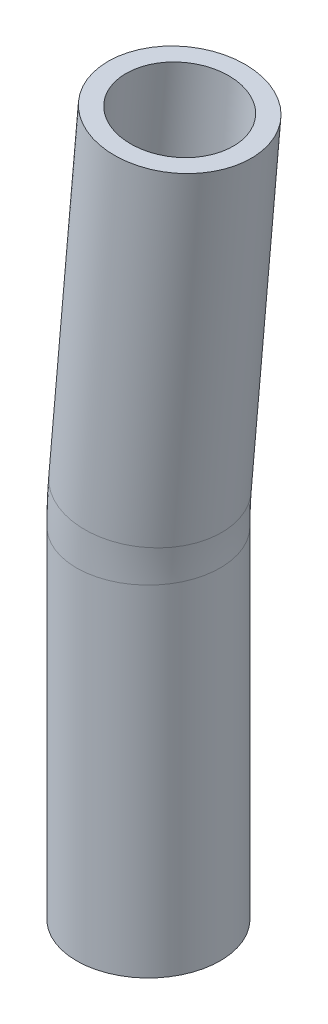
ISO-10303-21;
HEADER;
FILE_DESCRIPTION(('STEP AP214'),'2;1');
FILE_NAME('part.step','',(''),(''),'','','');
FILE_SCHEMA(('AUTOMOTIVE_DESIGN { 1 0 10303 214 1 1 1 1 }'));
ENDSEC;
DATA;
#1=APPLICATION_CONTEXT('core data for automotive mechanical design processes');
#2=APPLICATION_PROTOCOL_DEFINITION('international standard','automotive_design',2000,#1);
#3=PRODUCT_CONTEXT('',#1,'mechanical');
#4=PRODUCT('Part','Part','',(#3));
#5=PRODUCT_RELATED_PRODUCT_CATEGORY('part','',(#4));
#6=PRODUCT_DEFINITION_FORMATION('','',#4);
#7=PRODUCT_DEFINITION_CONTEXT('part definition',#1,'design');
#8=PRODUCT_DEFINITION('design','',#6,#7);
#9=PRODUCT_DEFINITION_SHAPE('','',#8);
#10=(LENGTH_UNIT() NAMED_UNIT(*) SI_UNIT(.MILLI.,.METRE.));
#11=(NAMED_UNIT(*) PLANE_ANGLE_UNIT() SI_UNIT($,.RADIAN.));
#12=(NAMED_UNIT(*) SI_UNIT($,.STERADIAN.) SOLID_ANGLE_UNIT());
#13=UNCERTAINTY_MEASURE_WITH_UNIT(LENGTH_MEASURE(1.E-05),#10,'distance_accuracy_value','');
#14=(GEOMETRIC_REPRESENTATION_CONTEXT(3) GLOBAL_UNCERTAINTY_ASSIGNED_CONTEXT((#13)) GLOBAL_UNIT_ASSIGNED_CONTEXT((#10,
#11,#12)) REPRESENTATION_CONTEXT('',''));
#15=CARTESIAN_POINT('',(0.,0.,0.));
#16=DIRECTION('',(0.,0.,1.));
#17=DIRECTION('',(1.,0.,0.));
#18=AXIS2_PLACEMENT_3D('',#15,#16,#17);
#19=CARTESIAN_POINT('',(0.,0.,0.));
#20=DIRECTION('',(0.,1.,0.));
#21=DIRECTION('',(0.,0.,1.));
#22=AXIS2_PLACEMENT_3D('',#19,#20,#21);
#23=CYLINDRICAL_SURFACE('',#22,4.);
#24=CARTESIAN_POINT('',(0.,18.9521373701957,0.));
#25=DIRECTION('',(0.,1.,0.));
#26=DIRECTION('',(0.,0.,1.));
#27=AXIS2_PLACEMENT_3D('',#24,#25,#26);
#28=CIRCLE('',#27,4.);
#29=CARTESIAN_POINT('',(-4.00000000000001,18.9521373701957,0.));
#30=VERTEX_POINT('',#29);
#31=EDGE_CURVE('E78',#30,#30,#28,.T.);
#32=ORIENTED_EDGE('',*,*,#31,.F.);
#33=EDGE_LOOP('',(#32));
#34=FACE_BOUND('',#33,.T.);
#35=CARTESIAN_POINT('',(0.,0.,0.));
#36=DIRECTION('',(0.,1.,0.));
#37=DIRECTION('',(0.,0.,1.));
#38=AXIS2_PLACEMENT_3D('',#35,#36,#37);
#39=CIRCLE('',#38,4.);
#40=CARTESIAN_POINT('',(0.,0.,4.));
#41=VERTEX_POINT('',#40);
#42=EDGE_CURVE('E47',#41,#41,#39,.T.);
#43=ORIENTED_EDGE('',*,*,#42,.T.);
#44=EDGE_LOOP('',(#43));
#45=FACE_BOUND('',#44,.T.);
#46=ADVANCED_FACE('F32',(#34,#45),#23,.T.);
#47=CARTESIAN_POINT('',(24.,18.9521373701957,0.));
#48=DIRECTION('',(0.,0.,-1.));
#49=DIRECTION('',(-1.,0.,0.));
#50=AXIS2_PLACEMENT_3D('',#47,#48,#49);
#51=TOROIDAL_SURFACE('',#50,24.,4.);
#52=CARTESIAN_POINT('',(0.0913272457980993,21.0438751961395,0.));
#53=DIRECTION('',(0.0871557427476586,0.996194698091745,0.));
#54=DIRECTION('',(0.,0.,1.));
#55=AXIS2_PLACEMENT_3D('',#52,#53,#54);
#56=CIRCLE('',#55,4.);
#57=CARTESIAN_POINT('',(-3.89345154656888,21.3924981671301,0.));
#58=VERTEX_POINT('',#57);
#59=EDGE_CURVE('E36',#58,#58,#56,.T.);
#60=CARTESIAN_POINT('',(24.,18.9521373701957,0.));
#61=DIRECTION('',(0.,0.,-1.));
#62=DIRECTION('',(-1.,0.,0.));
#63=AXIS2_PLACEMENT_3D('',#60,#61,#62);
#64=CIRCLE('',#63,28.);
#65=EDGE_CURVE('',#30,#58,#64,.T.);
#66=ORIENTED_EDGE('',*,*,#31,.T.);
#67=ORIENTED_EDGE('',*,*,#59,.F.);
#68=ORIENTED_EDGE('',*,*,#65,.T.);
#69=ORIENTED_EDGE('',*,*,#65,.F.);
#70=EDGE_LOOP('',(#66,#68,#67,#69));
#71=FACE_BOUND('',#70,.T.);
#72=ADVANCED_FACE('F86',(#71),#51,.T.);
#73=CARTESIAN_POINT('',(0.0913272457980959,21.0438751961395,0.));
#74=DIRECTION('',(0.0871557427476589,0.996194698091745,0.));
#75=DIRECTION('',(-0.996194698091746,0.0871557427476589,0.));
#76=AXIS2_PLACEMENT_3D('',#73,#74,#75);
#77=CYLINDRICAL_SURFACE('',#76,4.);
#78=CARTESIAN_POINT('',(1.74311485495317,39.9238939618349,0.));
#79=DIRECTION('',(0.0871557427476589,0.996194698091745,0.));
#80=DIRECTION('',(0.,0.,1.));
#81=AXIS2_PLACEMENT_3D('',#78,#79,#80);
#82=CIRCLE('',#81,4.);
#83=CARTESIAN_POINT('',(1.74311485495317,39.9238939618349,4.));
#84=VERTEX_POINT('',#83);
#85=EDGE_CURVE('E52',#84,#84,#82,.T.);
#86=ORIENTED_EDGE('',*,*,#85,.F.);
#87=EDGE_LOOP('',(#86));
#88=FACE_BOUND('',#87,.T.);
#89=ORIENTED_EDGE('',*,*,#59,.T.);
#90=EDGE_LOOP('',(#89));
#91=FACE_BOUND('',#90,.T.);
#92=ADVANCED_FACE('F34',(#88,#91),#77,.T.);
#93=CARTESIAN_POINT('',(0.,0.,0.));
#94=DIRECTION('',(0.,1.,0.));
#95=DIRECTION('',(0.,0.,1.));
#96=AXIS2_PLACEMENT_3D('',#93,#94,#95);
#97=PLANE('',#96);
#98=CARTESIAN_POINT('',(0.,0.,0.));
#99=DIRECTION('',(0.,1.,0.));
#100=DIRECTION('',(0.,0.,1.));
#101=AXIS2_PLACEMENT_3D('',#98,#99,#100);
#102=CIRCLE('',#101,3.);
#103=CARTESIAN_POINT('',(0.,0.,3.));
#104=VERTEX_POINT('',#103);
#105=EDGE_CURVE('E73',#104,#104,#102,.F.);
#106=ORIENTED_EDGE('',*,*,#105,.F.);
#107=EDGE_LOOP('',(#106));
#108=FACE_BOUND('',#107,.T.);
#109=ORIENTED_EDGE('',*,*,#42,.F.);
#110=EDGE_LOOP('',(#109));
#111=FACE_BOUND('',#110,.T.);
#112=ADVANCED_FACE('F92',(#108,#111),#97,.F.);
#113=CARTESIAN_POINT('',(1.74311485495317,39.9238939618349,0.));
#114=DIRECTION('',(0.0871557427476589,0.996194698091745,0.));
#115=DIRECTION('',(0.,0.,1.));
#116=AXIS2_PLACEMENT_3D('',#113,#114,#115);
#117=PLANE('',#116);
#118=CARTESIAN_POINT('',(1.74311485495317,39.9238939618349,0.));
#119=DIRECTION('',(0.0871557427476589,0.996194698091745,0.));
#120=DIRECTION('',(0.,0.,1.));
#121=AXIS2_PLACEMENT_3D('',#118,#119,#120);
#122=CIRCLE('',#121,3.);
#123=CARTESIAN_POINT('',(1.74311485495317,39.9238939618349,3.));
#124=VERTEX_POINT('',#123);
#125=EDGE_CURVE('E11',#124,#124,#122,.F.);
#126=ORIENTED_EDGE('',*,*,#125,.T.);
#127=EDGE_LOOP('',(#126));
#128=FACE_BOUND('',#127,.T.);
#129=ORIENTED_EDGE('',*,*,#85,.T.);
#130=EDGE_LOOP('',(#129));
#131=FACE_BOUND('',#130,.T.);
#132=ADVANCED_FACE('F59',(#128,#131),#117,.T.);
#133=CARTESIAN_POINT('',(0.,0.,0.));
#134=DIRECTION('',(0.,1.,0.));
#135=DIRECTION('',(0.,0.,1.));
#136=AXIS2_PLACEMENT_3D('',#133,#134,#135);
#137=CYLINDRICAL_SURFACE('',#136,3.);
#138=CARTESIAN_POINT('',(0.,18.9521373701957,0.));
#139=DIRECTION('',(0.,1.,0.));
#140=DIRECTION('',(0.,0.,1.));
#141=AXIS2_PLACEMENT_3D('',#138,#139,#140);
#142=CIRCLE('',#141,3.);
#143=CARTESIAN_POINT('',(-3.00000000000001,18.9521373701957,0.));
#144=VERTEX_POINT('',#143);
#145=EDGE_CURVE('E70',#144,#144,#142,.F.);
#146=ORIENTED_EDGE('',*,*,#145,.F.);
#147=EDGE_LOOP('',(#146));
#148=FACE_BOUND('',#147,.T.);
#149=ORIENTED_EDGE('',*,*,#105,.T.);
#150=EDGE_LOOP('',(#149));
#151=FACE_BOUND('',#150,.T.);
#152=ADVANCED_FACE('F100',(#148,#151),#137,.F.);
#153=CARTESIAN_POINT('',(24.,18.9521373701957,0.));
#154=DIRECTION('',(0.,0.,-1.));
#155=DIRECTION('',(-1.,0.,0.));
#156=AXIS2_PLACEMENT_3D('',#153,#154,#155);
#157=TOROIDAL_SURFACE('',#156,24.,3.);
#158=CARTESIAN_POINT('',(0.0913272457980993,21.0438751961395,0.));
#159=DIRECTION('',(0.0871557427476586,0.996194698091745,0.));
#160=DIRECTION('',(0.,0.,1.));
#161=AXIS2_PLACEMENT_3D('',#158,#159,#160);
#162=CIRCLE('',#161,3.);
#163=CARTESIAN_POINT('',(-2.89725684847713,21.3053424243824,0.));
#164=VERTEX_POINT('',#163);
#165=EDGE_CURVE('E41',#164,#164,#162,.F.);
#166=CARTESIAN_POINT('',(24.,18.9521373701957,0.));
#167=DIRECTION('',(0.,0.,-1.));
#168=DIRECTION('',(-1.,0.,0.));
#169=AXIS2_PLACEMENT_3D('',#166,#167,#168);
#170=CIRCLE('',#169,27.);
#171=EDGE_CURVE('',#144,#164,#170,.T.);
#172=ORIENTED_EDGE('',*,*,#145,.T.);
#173=ORIENTED_EDGE('',*,*,#165,.F.);
#174=ORIENTED_EDGE('',*,*,#171,.T.);
#175=ORIENTED_EDGE('',*,*,#171,.F.);
#176=EDGE_LOOP('',(#172,#174,#173,#175));
#177=FACE_BOUND('',#176,.T.);
#178=ADVANCED_FACE('F65',(#177),#157,.F.);
#179=CARTESIAN_POINT('',(0.0913272457980959,21.0438751961395,0.));
#180=DIRECTION('',(0.0871557427476589,0.996194698091745,0.));
#181=DIRECTION('',(-0.996194698091746,0.0871557427476589,0.));
#182=AXIS2_PLACEMENT_3D('',#179,#180,#181);
#183=CYLINDRICAL_SURFACE('',#182,3.);
#184=ORIENTED_EDGE('',*,*,#125,.F.);
#185=EDGE_LOOP('',(#184));
#186=FACE_BOUND('',#185,.T.);
#187=ORIENTED_EDGE('',*,*,#165,.T.);
#188=EDGE_LOOP('',(#187));
#189=FACE_BOUND('',#188,.T.);
#190=ADVANCED_FACE('F62',(#186,#189),#183,.F.);
#191=CLOSED_SHELL('',(#46,#72,#92,#112,#132,#152,#178,#190));
#192=MANIFOLD_SOLID_BREP('B2',#191);
#193=ADVANCED_BREP_SHAPE_REPRESENTATION('',(#18,#192),#14);
#194=SHAPE_DEFINITION_REPRESENTATION(#9,#193);
ENDSEC;
END-ISO-10303-21;
